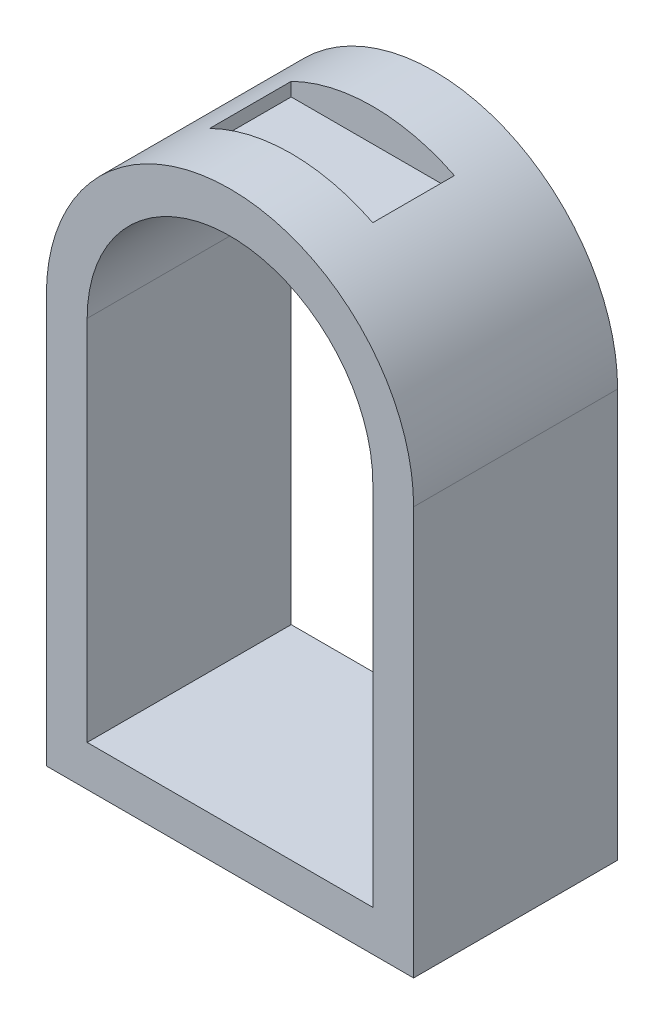
ISO-10303-21;
HEADER;
FILE_DESCRIPTION(('STEP AP214'),'2;1');
FILE_NAME('part.step','',(''),(''),'','','');
FILE_SCHEMA(('AUTOMOTIVE_DESIGN { 1 0 10303 214 1 1 1 1 }'));
ENDSEC;
DATA;
#1=APPLICATION_CONTEXT('core data for automotive mechanical design processes');
#2=APPLICATION_PROTOCOL_DEFINITION('international standard','automotive_design',2000,#1);
#3=PRODUCT_CONTEXT('',#1,'mechanical');
#4=PRODUCT('Part','Part','',(#3));
#5=PRODUCT_RELATED_PRODUCT_CATEGORY('part','',(#4));
#6=PRODUCT_DEFINITION_FORMATION('','',#4);
#7=PRODUCT_DEFINITION_CONTEXT('part definition',#1,'design');
#8=PRODUCT_DEFINITION('design','',#6,#7);
#9=PRODUCT_DEFINITION_SHAPE('','',#8);
#10=(LENGTH_UNIT() NAMED_UNIT(*) SI_UNIT(.MILLI.,.METRE.));
#11=(NAMED_UNIT(*) PLANE_ANGLE_UNIT() SI_UNIT($,.RADIAN.));
#12=(NAMED_UNIT(*) SI_UNIT($,.STERADIAN.) SOLID_ANGLE_UNIT());
#13=UNCERTAINTY_MEASURE_WITH_UNIT(LENGTH_MEASURE(1.E-05),#10,'distance_accuracy_value','');
#14=(GEOMETRIC_REPRESENTATION_CONTEXT(3) GLOBAL_UNCERTAINTY_ASSIGNED_CONTEXT((#13)) GLOBAL_UNIT_ASSIGNED_CONTEXT((#10,
#11,#12)) REPRESENTATION_CONTEXT('',''));
#15=CARTESIAN_POINT('',(0.,0.,0.));
#16=DIRECTION('',(0.,0.,1.));
#17=DIRECTION('',(1.,0.,0.));
#18=AXIS2_PLACEMENT_3D('',#15,#16,#17);
#19=CARTESIAN_POINT('',(-88.9,228.6,127.));
#20=DIRECTION('',(0.,0.,-1.));
#21=DIRECTION('',(-1.,0.,0.));
#22=AXIS2_PLACEMENT_3D('',#19,#20,#21);
#23=PLANE('',#22);
#24=DIRECTION('',(1.,0.,0.));
#25=VECTOR('',#24,1.);
#26=CARTESIAN_POINT('',(-88.9,-25.4,127.));
#27=LINE('',#26,#25);
#28=CARTESIAN_POINT('',(-203.2,-25.4,127.));
#29=VERTEX_POINT('',#28);
#30=CARTESIAN_POINT('',(25.4,-25.4,127.));
#31=VERTEX_POINT('',#30);
#32=EDGE_CURVE('E208',#29,#31,#27,.T.);
#33=ORIENTED_EDGE('',*,*,#32,.T.);
#34=DIRECTION('',(0.,1.,0.));
#35=VECTOR('',#34,1.);
#36=CARTESIAN_POINT('',(25.4,228.6,127.));
#37=LINE('',#36,#35);
#38=CARTESIAN_POINT('',(25.4,228.6,127.));
#39=VERTEX_POINT('',#38);
#40=EDGE_CURVE('E211',#31,#39,#37,.T.);
#41=ORIENTED_EDGE('',*,*,#40,.T.);
#42=CARTESIAN_POINT('',(-88.9,228.6,127.));
#43=DIRECTION('',(0.,0.,-1.));
#44=DIRECTION('',(-1.,0.,0.));
#45=AXIS2_PLACEMENT_3D('',#42,#43,#44);
#46=CIRCLE('',#45,114.3);
#47=CARTESIAN_POINT('',(-203.2,228.6,127.));
#48=VERTEX_POINT('',#47);
#49=EDGE_CURVE('E214',#48,#39,#46,.T.);
#50=ORIENTED_EDGE('',*,*,#49,.F.);
#51=DIRECTION('',(0.,-1.,0.));
#52=VECTOR('',#51,1.);
#53=CARTESIAN_POINT('',(-203.2,228.6,127.));
#54=LINE('',#53,#52);
#55=EDGE_CURVE('E217',#48,#29,#54,.T.);
#56=ORIENTED_EDGE('',*,*,#55,.T.);
#57=EDGE_LOOP('',(#33,#41,#50,#56));
#58=FACE_BOUND('',#57,.T.);
#59=DIRECTION('',(1.,0.,0.));
#60=VECTOR('',#59,1.);
#61=CARTESIAN_POINT('',(-177.8,0.,127.));
#62=LINE('',#61,#60);
#63=CARTESIAN_POINT('',(-177.8,0.,127.));
#64=VERTEX_POINT('',#63);
#65=CARTESIAN_POINT('',(0.,0.,127.));
#66=VERTEX_POINT('',#65);
#67=EDGE_CURVE('E182',#64,#66,#62,.T.);
#68=ORIENTED_EDGE('',*,*,#67,.F.);
#69=DIRECTION('',(0.,-1.,0.));
#70=VECTOR('',#69,1.);
#71=CARTESIAN_POINT('',(-177.8,228.6,127.));
#72=LINE('',#71,#70);
#73=CARTESIAN_POINT('',(-177.8,228.6,127.));
#74=VERTEX_POINT('',#73);
#75=EDGE_CURVE('E188',#74,#64,#72,.T.);
#76=ORIENTED_EDGE('',*,*,#75,.F.);
#77=CARTESIAN_POINT('',(-88.9,228.6,127.));
#78=DIRECTION('',(0.,0.,-1.));
#79=DIRECTION('',(-1.,0.,0.));
#80=AXIS2_PLACEMENT_3D('',#77,#78,#79);
#81=CIRCLE('',#80,88.9);
#82=CARTESIAN_POINT('',(0.,228.6,127.));
#83=VERTEX_POINT('',#82);
#84=EDGE_CURVE('E72',#74,#83,#81,.T.);
#85=ORIENTED_EDGE('',*,*,#84,.T.);
#86=DIRECTION('',(0.,1.,0.));
#87=VECTOR('',#86,1.);
#88=CARTESIAN_POINT('',(0.,0.,127.));
#89=LINE('',#88,#87);
#90=EDGE_CURVE('E184',#66,#83,#89,.T.);
#91=ORIENTED_EDGE('',*,*,#90,.F.);
#92=EDGE_LOOP('',(#68,#76,#85,#91));
#93=FACE_BOUND('',#92,.T.);
#94=ADVANCED_FACE('F57',(#58,#93),#23,.F.);
#95=CARTESIAN_POINT('',(-88.9,228.6,0.));
#96=DIRECTION('',(0.,0.,-1.));
#97=DIRECTION('',(-1.,0.,0.));
#98=AXIS2_PLACEMENT_3D('',#95,#96,#97);
#99=PLANE('',#98);
#100=DIRECTION('',(1.,0.,0.));
#101=VECTOR('',#100,1.);
#102=CARTESIAN_POINT('',(-88.9,-25.4,0.));
#103=LINE('',#102,#101);
#104=CARTESIAN_POINT('',(-203.2,-25.4,0.));
#105=VERTEX_POINT('',#104);
#106=CARTESIAN_POINT('',(25.4,-25.4,0.));
#107=VERTEX_POINT('',#106);
#108=EDGE_CURVE('E207',#105,#107,#103,.T.);
#109=ORIENTED_EDGE('',*,*,#108,.F.);
#110=DIRECTION('',(0.,-1.,0.));
#111=VECTOR('',#110,1.);
#112=CARTESIAN_POINT('',(-203.2,228.6,0.));
#113=LINE('',#112,#111);
#114=CARTESIAN_POINT('',(-203.2,228.6,0.));
#115=VERTEX_POINT('',#114);
#116=EDGE_CURVE('E212',#115,#105,#113,.T.);
#117=ORIENTED_EDGE('',*,*,#116,.F.);
#118=CARTESIAN_POINT('',(-88.9,228.6,0.));
#119=DIRECTION('',(0.,0.,-1.));
#120=DIRECTION('',(-1.,0.,0.));
#121=AXIS2_PLACEMENT_3D('',#118,#119,#120);
#122=CIRCLE('',#121,114.3);
#123=CARTESIAN_POINT('',(25.4,228.6,0.));
#124=VERTEX_POINT('',#123);
#125=EDGE_CURVE('E225',#115,#124,#122,.T.);
#126=ORIENTED_EDGE('',*,*,#125,.T.);
#127=DIRECTION('',(0.,1.,0.));
#128=VECTOR('',#127,1.);
#129=CARTESIAN_POINT('',(25.4,228.6,0.));
#130=LINE('',#129,#128);
#131=EDGE_CURVE('E222',#107,#124,#130,.T.);
#132=ORIENTED_EDGE('',*,*,#131,.F.);
#133=EDGE_LOOP('',(#109,#117,#126,#132));
#134=FACE_BOUND('',#133,.T.);
#135=DIRECTION('',(0.,-1.,0.));
#136=VECTOR('',#135,1.);
#137=CARTESIAN_POINT('',(-177.8,228.6,0.));
#138=LINE('',#137,#136);
#139=CARTESIAN_POINT('',(-177.8,228.6,0.));
#140=VERTEX_POINT('',#139);
#141=CARTESIAN_POINT('',(-177.8,0.,0.));
#142=VERTEX_POINT('',#141);
#143=EDGE_CURVE('E185',#140,#142,#138,.T.);
#144=ORIENTED_EDGE('',*,*,#143,.T.);
#145=DIRECTION('',(1.,0.,0.));
#146=VECTOR('',#145,1.);
#147=CARTESIAN_POINT('',(-177.8,0.,0.));
#148=LINE('',#147,#146);
#149=CARTESIAN_POINT('',(0.,0.,0.));
#150=VERTEX_POINT('',#149);
#151=EDGE_CURVE('E80',#142,#150,#148,.T.);
#152=ORIENTED_EDGE('',*,*,#151,.T.);
#153=DIRECTION('',(0.,1.,0.));
#154=VECTOR('',#153,1.);
#155=CARTESIAN_POINT('',(0.,0.,0.));
#156=LINE('',#155,#154);
#157=CARTESIAN_POINT('',(0.,228.6,0.));
#158=VERTEX_POINT('',#157);
#159=EDGE_CURVE('E192',#150,#158,#156,.T.);
#160=ORIENTED_EDGE('',*,*,#159,.T.);
#161=CARTESIAN_POINT('',(-88.9,228.6,0.));
#162=DIRECTION('',(0.,0.,-1.));
#163=DIRECTION('',(-1.,0.,0.));
#164=AXIS2_PLACEMENT_3D('',#161,#162,#163);
#165=CIRCLE('',#164,88.9);
#166=EDGE_CURVE('E195',#140,#158,#165,.T.);
#167=ORIENTED_EDGE('',*,*,#166,.F.);
#168=EDGE_LOOP('',(#144,#152,#160,#167));
#169=FACE_BOUND('',#168,.T.);
#170=ADVANCED_FACE('F259',(#134,#169),#99,.T.);
#171=CARTESIAN_POINT('',(-88.9,-25.4,127.));
#172=DIRECTION('',(0.,1.,0.));
#173=DIRECTION('',(0.,0.,1.));
#174=AXIS2_PLACEMENT_3D('',#171,#172,#173);
#175=PLANE('',#174);
#176=ORIENTED_EDGE('',*,*,#108,.T.);
#177=DIRECTION('',(0.,0.,-1.));
#178=VECTOR('',#177,1.);
#179=CARTESIAN_POINT('',(25.4,-25.4,127.));
#180=LINE('',#179,#178);
#181=EDGE_CURVE('E235',#31,#107,#180,.T.);
#182=ORIENTED_EDGE('',*,*,#181,.F.);
#183=ORIENTED_EDGE('',*,*,#32,.F.);
#184=DIRECTION('',(0.,0.,-1.));
#185=VECTOR('',#184,1.);
#186=CARTESIAN_POINT('',(-203.2,-25.4,127.));
#187=LINE('',#186,#185);
#188=EDGE_CURVE('E219',#29,#105,#187,.T.);
#189=ORIENTED_EDGE('',*,*,#188,.T.);
#190=EDGE_LOOP('',(#176,#182,#183,#189));
#191=FACE_BOUND('',#190,.T.);
#192=ADVANCED_FACE('F59',(#191),#175,.F.);
#193=CARTESIAN_POINT('',(25.4,228.6,127.));
#194=DIRECTION('',(-1.,0.,0.));
#195=DIRECTION('',(0.,0.,1.));
#196=AXIS2_PLACEMENT_3D('',#193,#194,#195);
#197=PLANE('',#196);
#198=ORIENTED_EDGE('',*,*,#131,.T.);
#199=DIRECTION('',(0.,0.,-1.));
#200=VECTOR('',#199,1.);
#201=CARTESIAN_POINT('',(25.4,228.6,127.));
#202=LINE('',#201,#200);
#203=EDGE_CURVE('E233',#39,#124,#202,.T.);
#204=ORIENTED_EDGE('',*,*,#203,.F.);
#205=ORIENTED_EDGE('',*,*,#40,.F.);
#206=ORIENTED_EDGE('',*,*,#181,.T.);
#207=EDGE_LOOP('',(#198,#204,#205,#206));
#208=FACE_BOUND('',#207,.T.);
#209=ADVANCED_FACE('F277',(#208),#197,.F.);
#210=CARTESIAN_POINT('',(-88.9,228.6,127.));
#211=DIRECTION('',(0.,0.,-1.));
#212=DIRECTION('',(-1.,0.,0.));
#213=AXIS2_PLACEMENT_3D('',#210,#211,#212);
#214=CYLINDRICAL_SURFACE('',#213,114.3);
#215=CARTESIAN_POINT('',(-88.9,228.6,38.1));
#216=DIRECTION('',(0.,0.,-1.));
#217=DIRECTION('',(-1.,0.,0.));
#218=AXIS2_PLACEMENT_3D('',#215,#216,#217);
#219=CIRCLE('',#218,114.3);
#220=CARTESIAN_POINT('',(-38.1,330.990673403392,38.1));
#221=VERTEX_POINT('',#220);
#222=CARTESIAN_POINT('',(-139.7,330.990673403392,38.1));
#223=VERTEX_POINT('',#222);
#224=EDGE_CURVE('E238',#221,#223,#219,.F.);
#225=ORIENTED_EDGE('',*,*,#224,.F.);
#226=DIRECTION('',(0.,0.,-1.));
#227=VECTOR('',#226,1.);
#228=CARTESIAN_POINT('',(-38.1,330.990673403392,127.));
#229=LINE('',#228,#227);
#230=CARTESIAN_POINT('',(-38.1,330.990673403392,88.9));
#231=VERTEX_POINT('',#230);
#232=EDGE_CURVE('E12',#231,#221,#229,.T.);
#233=ORIENTED_EDGE('',*,*,#232,.F.);
#234=CARTESIAN_POINT('',(-88.9,228.6,88.9));
#235=DIRECTION('',(0.,0.,1.));
#236=DIRECTION('',(1.,0.,0.));
#237=AXIS2_PLACEMENT_3D('',#234,#235,#236);
#238=CIRCLE('',#237,114.3);
#239=CARTESIAN_POINT('',(-139.7,330.990673403392,88.9));
#240=VERTEX_POINT('',#239);
#241=EDGE_CURVE('E65',#240,#231,#238,.F.);
#242=ORIENTED_EDGE('',*,*,#241,.F.);
#243=DIRECTION('',(0.,0.,-1.));
#244=VECTOR('',#243,1.);
#245=CARTESIAN_POINT('',(-139.7,330.990673403392,127.));
#246=LINE('',#245,#244);
#247=EDGE_CURVE('E240',#223,#240,#246,.F.);
#248=ORIENTED_EDGE('',*,*,#247,.F.);
#249=EDGE_LOOP('',(#225,#233,#242,#248));
#250=FACE_BOUND('',#249,.T.);
#251=ORIENTED_EDGE('',*,*,#125,.F.);
#252=DIRECTION('',(0.,0.,-1.));
#253=VECTOR('',#252,1.);
#254=CARTESIAN_POINT('',(-203.2,228.6,127.));
#255=LINE('',#254,#253);
#256=EDGE_CURVE('E231',#48,#115,#255,.T.);
#257=ORIENTED_EDGE('',*,*,#256,.F.);
#258=ORIENTED_EDGE('',*,*,#49,.T.);
#259=ORIENTED_EDGE('',*,*,#203,.T.);
#260=EDGE_LOOP('',(#251,#257,#258,#259));
#261=FACE_BOUND('',#260,.T.);
#262=ADVANCED_FACE('F246',(#250,#261),#214,.T.);
#263=CARTESIAN_POINT('',(-203.2,228.6,127.));
#264=DIRECTION('',(1.,0.,0.));
#265=DIRECTION('',(0.,1.,0.));
#266=AXIS2_PLACEMENT_3D('',#263,#264,#265);
#267=PLANE('',#266);
#268=ORIENTED_EDGE('',*,*,#116,.T.);
#269=ORIENTED_EDGE('',*,*,#188,.F.);
#270=ORIENTED_EDGE('',*,*,#55,.F.);
#271=ORIENTED_EDGE('',*,*,#256,.T.);
#272=EDGE_LOOP('',(#268,#269,#270,#271));
#273=FACE_BOUND('',#272,.T.);
#274=ADVANCED_FACE('F272',(#273),#267,.F.);
#275=CARTESIAN_POINT('',(-177.8,0.,127.));
#276=DIRECTION('',(0.,1.,0.));
#277=DIRECTION('',(0.,0.,1.));
#278=AXIS2_PLACEMENT_3D('',#275,#276,#277);
#279=PLANE('',#278);
#280=ORIENTED_EDGE('',*,*,#151,.F.);
#281=DIRECTION('',(0.,0.,-1.));
#282=VECTOR('',#281,1.);
#283=CARTESIAN_POINT('',(-177.8,0.,127.));
#284=LINE('',#283,#282);
#285=EDGE_CURVE('E190',#64,#142,#284,.T.);
#286=ORIENTED_EDGE('',*,*,#285,.F.);
#287=ORIENTED_EDGE('',*,*,#67,.T.);
#288=DIRECTION('',(0.,0.,-1.));
#289=VECTOR('',#288,1.);
#290=CARTESIAN_POINT('',(0.,0.,127.));
#291=LINE('',#290,#289);
#292=EDGE_CURVE('E205',#66,#150,#291,.T.);
#293=ORIENTED_EDGE('',*,*,#292,.T.);
#294=EDGE_LOOP('',(#280,#286,#287,#293));
#295=FACE_BOUND('',#294,.T.);
#296=ADVANCED_FACE('F269',(#295),#279,.T.);
#297=CARTESIAN_POINT('',(0.,0.,127.));
#298=DIRECTION('',(-1.,0.,0.));
#299=DIRECTION('',(0.,0.,1.));
#300=AXIS2_PLACEMENT_3D('',#297,#298,#299);
#301=PLANE('',#300);
#302=ORIENTED_EDGE('',*,*,#159,.F.);
#303=ORIENTED_EDGE('',*,*,#292,.F.);
#304=ORIENTED_EDGE('',*,*,#90,.T.);
#305=DIRECTION('',(0.,0.,-1.));
#306=VECTOR('',#305,1.);
#307=CARTESIAN_POINT('',(0.,228.6,127.));
#308=LINE('',#307,#306);
#309=EDGE_CURVE('E203',#83,#158,#308,.T.);
#310=ORIENTED_EDGE('',*,*,#309,.T.);
#311=EDGE_LOOP('',(#302,#303,#304,#310));
#312=FACE_BOUND('',#311,.T.);
#313=ADVANCED_FACE('F303',(#312),#301,.T.);
#314=CARTESIAN_POINT('',(-88.9,228.6,127.));
#315=DIRECTION('',(0.,0.,-1.));
#316=DIRECTION('',(-1.,0.,0.));
#317=AXIS2_PLACEMENT_3D('',#314,#315,#316);
#318=CYLINDRICAL_SURFACE('',#317,88.9);
#319=ORIENTED_EDGE('',*,*,#166,.T.);
#320=ORIENTED_EDGE('',*,*,#309,.F.);
#321=ORIENTED_EDGE('',*,*,#84,.F.);
#322=DIRECTION('',(0.,0.,-1.));
#323=VECTOR('',#322,1.);
#324=CARTESIAN_POINT('',(-177.8,228.6,127.));
#325=LINE('',#324,#323);
#326=EDGE_CURVE('E201',#74,#140,#325,.T.);
#327=ORIENTED_EDGE('',*,*,#326,.T.);
#328=EDGE_LOOP('',(#319,#320,#321,#327));
#329=FACE_BOUND('',#328,.T.);
#330=ADVANCED_FACE('F304',(#329),#318,.F.);
#331=CARTESIAN_POINT('',(-177.8,228.6,127.));
#332=DIRECTION('',(1.,0.,0.));
#333=DIRECTION('',(0.,1.,0.));
#334=AXIS2_PLACEMENT_3D('',#331,#332,#333);
#335=PLANE('',#334);
#336=ORIENTED_EDGE('',*,*,#143,.F.);
#337=ORIENTED_EDGE('',*,*,#326,.F.);
#338=ORIENTED_EDGE('',*,*,#75,.T.);
#339=ORIENTED_EDGE('',*,*,#285,.T.);
#340=EDGE_LOOP('',(#336,#337,#338,#339));
#341=FACE_BOUND('',#340,.T.);
#342=ADVANCED_FACE('F297',(#341),#335,.T.);
#343=CARTESIAN_POINT('',(-38.1,322.58,88.9));
#344=DIRECTION('',(1.,0.,0.));
#345=DIRECTION('',(0.,0.,-1.));
#346=AXIS2_PLACEMENT_3D('',#343,#344,#345);
#347=PLANE('',#346);
#348=ORIENTED_EDGE('',*,*,#232,.T.);
#349=DIRECTION('',(0.,1.,0.));
#350=VECTOR('',#349,1.);
#351=CARTESIAN_POINT('',(-38.1,322.58,38.1));
#352=LINE('',#351,#350);
#353=CARTESIAN_POINT('',(-38.1,322.58,38.1));
#354=VERTEX_POINT('',#353);
#355=EDGE_CURVE('E149',#354,#221,#352,.T.);
#356=ORIENTED_EDGE('',*,*,#355,.F.);
#357=DIRECTION('',(0.,0.,-1.));
#358=VECTOR('',#357,1.);
#359=CARTESIAN_POINT('',(-38.1,322.58,88.9));
#360=LINE('',#359,#358);
#361=CARTESIAN_POINT('',(-38.1,322.58,88.9));
#362=VERTEX_POINT('',#361);
#363=EDGE_CURVE('E154',#362,#354,#360,.T.);
#364=ORIENTED_EDGE('',*,*,#363,.F.);
#365=DIRECTION('',(0.,1.,0.));
#366=VECTOR('',#365,1.);
#367=CARTESIAN_POINT('',(-38.1,322.58,88.9));
#368=LINE('',#367,#366);
#369=EDGE_CURVE('E176',#362,#231,#368,.T.);
#370=ORIENTED_EDGE('',*,*,#369,.T.);
#371=EDGE_LOOP('',(#348,#356,#364,#370));
#372=FACE_BOUND('',#371,.T.);
#373=ADVANCED_FACE('F151',(#372),#347,.F.);
#374=CARTESIAN_POINT('',(-139.7,322.58,88.9));
#375=DIRECTION('',(0.,0.,1.));
#376=DIRECTION('',(1.,0.,0.));
#377=AXIS2_PLACEMENT_3D('',#374,#375,#376);
#378=PLANE('',#377);
#379=DIRECTION('',(0.,1.,0.));
#380=VECTOR('',#379,1.);
#381=CARTESIAN_POINT('',(-139.7,322.58,88.9));
#382=LINE('',#381,#380);
#383=CARTESIAN_POINT('',(-139.7,322.58,88.9));
#384=VERTEX_POINT('',#383);
#385=EDGE_CURVE('E178',#384,#240,#382,.T.);
#386=ORIENTED_EDGE('',*,*,#385,.T.);
#387=ORIENTED_EDGE('',*,*,#241,.T.);
#388=ORIENTED_EDGE('',*,*,#369,.F.);
#389=DIRECTION('',(1.,0.,0.));
#390=VECTOR('',#389,1.);
#391=CARTESIAN_POINT('',(-139.7,322.58,88.9));
#392=LINE('',#391,#390);
#393=EDGE_CURVE('E159',#384,#362,#392,.T.);
#394=ORIENTED_EDGE('',*,*,#393,.F.);
#395=EDGE_LOOP('',(#386,#387,#388,#394));
#396=FACE_BOUND('',#395,.T.);
#397=ADVANCED_FACE('F243',(#396),#378,.F.);
#398=CARTESIAN_POINT('',(-139.7,322.58,88.9));
#399=DIRECTION('',(-1.,0.,0.));
#400=DIRECTION('',(0.,0.,1.));
#401=AXIS2_PLACEMENT_3D('',#398,#399,#400);
#402=PLANE('',#401);
#403=ORIENTED_EDGE('',*,*,#247,.T.);
#404=ORIENTED_EDGE('',*,*,#385,.F.);
#405=DIRECTION('',(0.,0.,1.));
#406=VECTOR('',#405,1.);
#407=CARTESIAN_POINT('',(-139.7,322.58,88.9));
#408=LINE('',#407,#406);
#409=CARTESIAN_POINT('',(-139.7,322.58,38.1));
#410=VERTEX_POINT('',#409);
#411=EDGE_CURVE('E168',#410,#384,#408,.T.);
#412=ORIENTED_EDGE('',*,*,#411,.F.);
#413=DIRECTION('',(0.,1.,0.));
#414=VECTOR('',#413,1.);
#415=CARTESIAN_POINT('',(-139.7,322.58,38.1));
#416=LINE('',#415,#414);
#417=EDGE_CURVE('E158',#410,#223,#416,.T.);
#418=ORIENTED_EDGE('',*,*,#417,.T.);
#419=EDGE_LOOP('',(#403,#404,#412,#418));
#420=FACE_BOUND('',#419,.T.);
#421=ADVANCED_FACE('F249',(#420),#402,.F.);
#422=CARTESIAN_POINT('',(-139.7,322.58,38.1));
#423=DIRECTION('',(0.,0.,-1.));
#424=DIRECTION('',(-1.,0.,0.));
#425=AXIS2_PLACEMENT_3D('',#422,#423,#424);
#426=PLANE('',#425);
#427=ORIENTED_EDGE('',*,*,#355,.T.);
#428=ORIENTED_EDGE('',*,*,#224,.T.);
#429=ORIENTED_EDGE('',*,*,#417,.F.);
#430=DIRECTION('',(-1.,0.,0.));
#431=VECTOR('',#430,1.);
#432=CARTESIAN_POINT('',(-139.7,322.58,38.1));
#433=LINE('',#432,#431);
#434=EDGE_CURVE('E162',#354,#410,#433,.T.);
#435=ORIENTED_EDGE('',*,*,#434,.F.);
#436=EDGE_LOOP('',(#427,#428,#429,#435));
#437=FACE_BOUND('',#436,.T.);
#438=ADVANCED_FACE('F163',(#437),#426,.F.);
#439=CARTESIAN_POINT('',(0.,322.58,0.));
#440=DIRECTION('',(0.,-1.,0.));
#441=DIRECTION('',(0.,0.,-1.));
#442=AXIS2_PLACEMENT_3D('',#439,#440,#441);
#443=PLANE('',#442);
#444=ORIENTED_EDGE('',*,*,#363,.T.);
#445=ORIENTED_EDGE('',*,*,#434,.T.);
#446=ORIENTED_EDGE('',*,*,#411,.T.);
#447=ORIENTED_EDGE('',*,*,#393,.T.);
#448=EDGE_LOOP('',(#444,#445,#446,#447));
#449=FACE_BOUND('',#448,.T.);
#450=ADVANCED_FACE('F170',(#449),#443,.F.);
#451=CLOSED_SHELL('',(#94,#170,#192,#209,#262,#274,#296,#313,#330,#342,#373,#397,#421,#438,#450));
#452=MANIFOLD_SOLID_BREP('B2',#451);
#453=ADVANCED_BREP_SHAPE_REPRESENTATION('',(#18,#452),#14);
#454=SHAPE_DEFINITION_REPRESENTATION(#9,#453);
ENDSEC;
END-ISO-10303-21;
